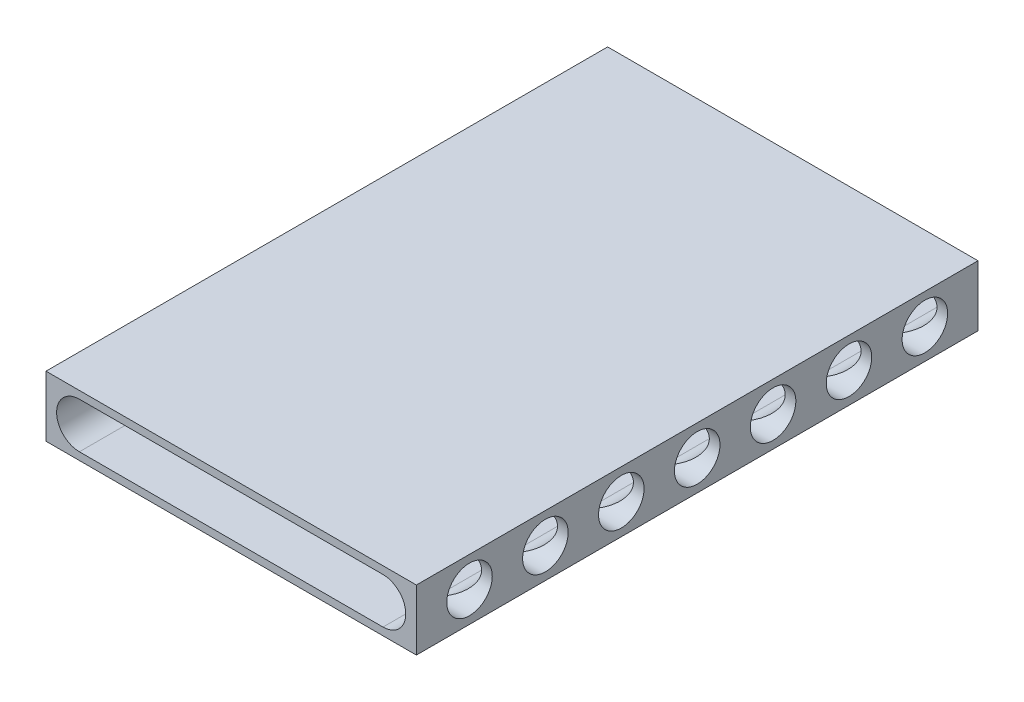
ISO-10303-21;
HEADER;
FILE_DESCRIPTION(('STEP AP214'),'2;1');
FILE_NAME('part.step','',(''),(''),'','','');
FILE_SCHEMA(('AUTOMOTIVE_DESIGN { 1 0 10303 214 1 1 1 1 }'));
ENDSEC;
DATA;
#1=APPLICATION_CONTEXT('core data for automotive mechanical design processes');
#2=APPLICATION_PROTOCOL_DEFINITION('international standard','automotive_design',2000,#1);
#3=PRODUCT_CONTEXT('',#1,'mechanical');
#4=PRODUCT('Part','Part','',(#3));
#5=PRODUCT_RELATED_PRODUCT_CATEGORY('part','',(#4));
#6=PRODUCT_DEFINITION_FORMATION('','',#4);
#7=PRODUCT_DEFINITION_CONTEXT('part definition',#1,'design');
#8=PRODUCT_DEFINITION('design','',#6,#7);
#9=PRODUCT_DEFINITION_SHAPE('','',#8);
#10=(LENGTH_UNIT() NAMED_UNIT(*) SI_UNIT(.MILLI.,.METRE.));
#11=(NAMED_UNIT(*) PLANE_ANGLE_UNIT() SI_UNIT($,.RADIAN.));
#12=(NAMED_UNIT(*) SI_UNIT($,.STERADIAN.) SOLID_ANGLE_UNIT());
#13=UNCERTAINTY_MEASURE_WITH_UNIT(LENGTH_MEASURE(1.E-05),#10,'distance_accuracy_value','');
#14=(GEOMETRIC_REPRESENTATION_CONTEXT(3) GLOBAL_UNCERTAINTY_ASSIGNED_CONTEXT((#13)) GLOBAL_UNIT_ASSIGNED_CONTEXT((#10,
#11,#12)) REPRESENTATION_CONTEXT('',''));
#15=CARTESIAN_POINT('',(0.,0.,0.));
#16=DIRECTION('',(0.,0.,1.));
#17=DIRECTION('',(1.,0.,0.));
#18=AXIS2_PLACEMENT_3D('',#15,#16,#17);
#19=CARTESIAN_POINT('',(50.,10.,-92.5));
#20=DIRECTION('',(0.,0.,1.));
#21=DIRECTION('',(1.,0.,0.));
#22=AXIS2_PLACEMENT_3D('',#19,#20,#21);
#23=CYLINDRICAL_SURFACE('',#22,7.5);
#24=DIRECTION('',(0.,0.,1.));
#25=VECTOR('',#24,1.);
#26=CARTESIAN_POINT('',(50.,2.50000000000003,-92.5));
#27=LINE('',#26,#25);
#28=CARTESIAN_POINT('',(50.,2.50000000000003,50.));
#29=VERTEX_POINT('',#28);
#30=CARTESIAN_POINT('',(50.,2.50000000000003,75.));
#31=VERTEX_POINT('',#30);
#32=EDGE_CURVE('E163',#29,#31,#27,.T.);
#33=ORIENTED_EDGE('',*,*,#32,.T.);
#34=CARTESIAN_POINT('',(50.,10.,75.));
#35=DIRECTION('',(0.707106781186547,0.,0.707106781186547));
#36=DIRECTION('',(0.707106781186547,0.,-0.707106781186547));
#37=AXIS2_PLACEMENT_3D('',#34,#35,#36);
#38=ELLIPSE('',#37,10.6066017177982,7.50000000000001);
#39=CARTESIAN_POINT('',(50.,17.5,75.));
#40=VERTEX_POINT('',#39);
#41=EDGE_CURVE('E58',#40,#31,#38,.F.);
#42=ORIENTED_EDGE('',*,*,#41,.F.);
#43=DIRECTION('',(0.,0.,1.));
#44=VECTOR('',#43,1.);
#45=CARTESIAN_POINT('',(50.,17.5,-92.5));
#46=LINE('',#45,#44);
#47=CARTESIAN_POINT('',(50.,17.5,50.));
#48=VERTEX_POINT('',#47);
#49=EDGE_CURVE('E160',#48,#40,#46,.T.);
#50=ORIENTED_EDGE('',*,*,#49,.F.);
#51=CARTESIAN_POINT('',(50.,10.,50.));
#52=DIRECTION('',(0.707106781186547,0.,-0.707106781186547));
#53=DIRECTION('',(0.707106781186547,0.,0.707106781186547));
#54=AXIS2_PLACEMENT_3D('',#51,#52,#53);
#55=ELLIPSE('',#54,10.6066017177982,7.50000000000001);
#56=EDGE_CURVE('E154',#29,#48,#55,.F.);
#57=ORIENTED_EDGE('',*,*,#56,.F.);
#58=EDGE_LOOP('',(#33,#42,#50,#57));
#59=FACE_BOUND('',#58,.T.);
#60=ADVANCED_FACE('F43',(#59),#23,.F.);
#61=CARTESIAN_POINT('',(50.,2.50000000000003,25.));
#62=VERTEX_POINT('',#61);
#63=EDGE_CURVE('E340',#62,#29,#27,.T.);
#64=ORIENTED_EDGE('',*,*,#63,.T.);
#65=CARTESIAN_POINT('',(50.,10.,50.));
#66=DIRECTION('',(0.707106781186547,0.,0.707106781186547));
#67=DIRECTION('',(0.707106781186547,0.,-0.707106781186547));
#68=AXIS2_PLACEMENT_3D('',#65,#66,#67);
#69=ELLIPSE('',#68,10.6066017177982,7.50000000000001);
#70=EDGE_CURVE('E65',#48,#29,#69,.F.);
#71=ORIENTED_EDGE('',*,*,#70,.F.);
#72=CARTESIAN_POINT('',(50.,17.5,25.));
#73=VERTEX_POINT('',#72);
#74=EDGE_CURVE('E182',#73,#48,#46,.T.);
#75=ORIENTED_EDGE('',*,*,#74,.F.);
#76=CARTESIAN_POINT('',(50.,10.,25.));
#77=DIRECTION('',(0.707106781186547,0.,-0.707106781186547));
#78=DIRECTION('',(0.707106781186547,0.,0.707106781186547));
#79=AXIS2_PLACEMENT_3D('',#76,#77,#78);
#80=ELLIPSE('',#79,10.6066017177982,7.50000000000001);
#81=EDGE_CURVE('E412',#62,#73,#80,.F.);
#82=ORIENTED_EDGE('',*,*,#81,.F.);
#83=EDGE_LOOP('',(#64,#71,#75,#82));
#84=FACE_BOUND('',#83,.T.);
#85=ADVANCED_FACE('F270',(#84),#23,.F.);
#86=CARTESIAN_POINT('',(50.,2.50000000000003,0.));
#87=VERTEX_POINT('',#86);
#88=EDGE_CURVE('E342',#87,#62,#27,.T.);
#89=ORIENTED_EDGE('',*,*,#88,.T.);
#90=CARTESIAN_POINT('',(50.,10.,25.));
#91=DIRECTION('',(0.707106781186547,0.,0.707106781186547));
#92=DIRECTION('',(0.707106781186547,0.,-0.707106781186547));
#93=AXIS2_PLACEMENT_3D('',#90,#91,#92);
#94=ELLIPSE('',#93,10.6066017177982,7.50000000000001);
#95=EDGE_CURVE('E409',#73,#62,#94,.F.);
#96=ORIENTED_EDGE('',*,*,#95,.F.);
#97=CARTESIAN_POINT('',(50.,17.5,0.));
#98=VERTEX_POINT('',#97);
#99=EDGE_CURVE('E185',#98,#73,#46,.T.);
#100=ORIENTED_EDGE('',*,*,#99,.F.);
#101=CARTESIAN_POINT('',(50.,10.,0.));
#102=DIRECTION('',(0.707106781186547,0.,-0.707106781186547));
#103=DIRECTION('',(0.707106781186547,0.,0.707106781186547));
#104=AXIS2_PLACEMENT_3D('',#101,#102,#103);
#105=ELLIPSE('',#104,10.6066017177982,7.50000000000001);
#106=EDGE_CURVE('E402',#87,#98,#105,.F.);
#107=ORIENTED_EDGE('',*,*,#106,.F.);
#108=EDGE_LOOP('',(#89,#96,#100,#107));
#109=FACE_BOUND('',#108,.T.);
#110=ADVANCED_FACE('F275',(#109),#23,.F.);
#111=CARTESIAN_POINT('',(50.,2.50000000000003,-25.));
#112=VERTEX_POINT('',#111);
#113=EDGE_CURVE('E346',#112,#87,#27,.T.);
#114=ORIENTED_EDGE('',*,*,#113,.T.);
#115=CARTESIAN_POINT('',(50.,10.,0.));
#116=DIRECTION('',(0.707106781186547,0.,0.707106781186547));
#117=DIRECTION('',(0.707106781186547,0.,-0.707106781186547));
#118=AXIS2_PLACEMENT_3D('',#115,#116,#117);
#119=ELLIPSE('',#118,10.6066017177982,7.50000000000001);
#120=EDGE_CURVE('E399',#98,#87,#119,.F.);
#121=ORIENTED_EDGE('',*,*,#120,.F.);
#122=CARTESIAN_POINT('',(50.,17.5,-25.));
#123=VERTEX_POINT('',#122);
#124=EDGE_CURVE('E668',#123,#98,#46,.T.);
#125=ORIENTED_EDGE('',*,*,#124,.F.);
#126=CARTESIAN_POINT('',(50.,10.,-25.));
#127=DIRECTION('',(0.707106781186547,0.,-0.707106781186547));
#128=DIRECTION('',(0.707106781186547,0.,0.707106781186547));
#129=AXIS2_PLACEMENT_3D('',#126,#127,#128);
#130=ELLIPSE('',#129,10.6066017177982,7.50000000000001);
#131=EDGE_CURVE('E392',#112,#123,#130,.F.);
#132=ORIENTED_EDGE('',*,*,#131,.F.);
#133=EDGE_LOOP('',(#114,#121,#125,#132));
#134=FACE_BOUND('',#133,.T.);
#135=ADVANCED_FACE('F546',(#134),#23,.F.);
#136=CARTESIAN_POINT('',(50.,2.50000000000003,-50.));
#137=VERTEX_POINT('',#136);
#138=EDGE_CURVE('E353',#137,#112,#27,.T.);
#139=ORIENTED_EDGE('',*,*,#138,.T.);
#140=CARTESIAN_POINT('',(50.,10.,-25.));
#141=DIRECTION('',(0.707106781186547,0.,0.707106781186547));
#142=DIRECTION('',(0.707106781186547,0.,-0.707106781186547));
#143=AXIS2_PLACEMENT_3D('',#140,#141,#142);
#144=ELLIPSE('',#143,10.6066017177982,7.50000000000001);
#145=EDGE_CURVE('E389',#123,#112,#144,.F.);
#146=ORIENTED_EDGE('',*,*,#145,.F.);
#147=CARTESIAN_POINT('',(50.,17.5,-50.));
#148=VERTEX_POINT('',#147);
#149=EDGE_CURVE('E671',#148,#123,#46,.T.);
#150=ORIENTED_EDGE('',*,*,#149,.F.);
#151=CARTESIAN_POINT('',(50.,10.,-50.));
#152=DIRECTION('',(0.707106781186547,0.,-0.707106781186547));
#153=DIRECTION('',(0.707106781186547,0.,0.707106781186547));
#154=AXIS2_PLACEMENT_3D('',#151,#152,#153);
#155=ELLIPSE('',#154,10.6066017177982,7.50000000000001);
#156=EDGE_CURVE('E385',#137,#148,#155,.F.);
#157=ORIENTED_EDGE('',*,*,#156,.F.);
#158=EDGE_LOOP('',(#139,#146,#150,#157));
#159=FACE_BOUND('',#158,.T.);
#160=ADVANCED_FACE('F294',(#159),#23,.F.);
#161=CARTESIAN_POINT('',(50.,2.50000000000003,-75.));
#162=VERTEX_POINT('',#161);
#163=EDGE_CURVE('E196',#162,#137,#27,.T.);
#164=ORIENTED_EDGE('',*,*,#163,.T.);
#165=CARTESIAN_POINT('',(50.,10.,-50.));
#166=DIRECTION('',(0.707106781186547,0.,0.707106781186547));
#167=DIRECTION('',(0.707106781186547,0.,-0.707106781186547));
#168=AXIS2_PLACEMENT_3D('',#165,#166,#167);
#169=ELLIPSE('',#168,10.6066017177982,7.50000000000001);
#170=EDGE_CURVE('E366',#148,#137,#169,.F.);
#171=ORIENTED_EDGE('',*,*,#170,.F.);
#172=CARTESIAN_POINT('',(50.,17.5,-75.));
#173=VERTEX_POINT('',#172);
#174=EDGE_CURVE('E191',#173,#148,#46,.T.);
#175=ORIENTED_EDGE('',*,*,#174,.F.);
#176=CARTESIAN_POINT('',(50.,10.,-75.));
#177=DIRECTION('',(0.707106781186547,0.,-0.707106781186547));
#178=DIRECTION('',(0.707106781186547,0.,0.707106781186547));
#179=AXIS2_PLACEMENT_3D('',#176,#177,#178);
#180=ELLIPSE('',#179,10.6066017177982,7.50000000000001);
#181=EDGE_CURVE('E368',#162,#173,#180,.F.);
#182=ORIENTED_EDGE('',*,*,#181,.F.);
#183=EDGE_LOOP('',(#164,#171,#175,#182));
#184=FACE_BOUND('',#183,.T.);
#185=ADVANCED_FACE('F289',(#184),#23,.F.);
#186=CARTESIAN_POINT('',(50.,2.50000000000001,-92.5));
#187=VERTEX_POINT('',#186);
#188=EDGE_CURVE('E176',#187,#162,#27,.T.);
#189=ORIENTED_EDGE('',*,*,#188,.T.);
#190=CARTESIAN_POINT('',(50.,10.,-75.));
#191=DIRECTION('',(0.707106781186547,0.,0.707106781186547));
#192=DIRECTION('',(0.707106781186547,0.,-0.707106781186547));
#193=AXIS2_PLACEMENT_3D('',#190,#191,#192);
#194=ELLIPSE('',#193,10.6066017177982,7.50000000000001);
#195=EDGE_CURVE('E298',#173,#162,#194,.F.);
#196=ORIENTED_EDGE('',*,*,#195,.F.);
#197=CARTESIAN_POINT('',(50.,17.5,-92.5));
#198=VERTEX_POINT('',#197);
#199=EDGE_CURVE('E178',#198,#173,#46,.T.);
#200=ORIENTED_EDGE('',*,*,#199,.F.);
#201=CARTESIAN_POINT('',(50.,10.,-92.5));
#202=DIRECTION('',(0.,0.,1.));
#203=DIRECTION('',(1.,0.,0.));
#204=AXIS2_PLACEMENT_3D('',#201,#202,#203);
#205=CIRCLE('',#204,7.5);
#206=EDGE_CURVE('E301',#187,#198,#205,.T.);
#207=ORIENTED_EDGE('',*,*,#206,.F.);
#208=EDGE_LOOP('',(#189,#196,#200,#207));
#209=FACE_BOUND('',#208,.T.);
#210=ADVANCED_FACE('F266',(#209),#23,.F.);
#211=CARTESIAN_POINT('',(61.,20.,92.5));
#212=DIRECTION('',(-1.,0.,0.));
#213=DIRECTION('',(0.,0.,1.));
#214=AXIS2_PLACEMENT_3D('',#211,#212,#213);
#215=PLANE('',#214);
#216=CARTESIAN_POINT('',(61.,10.,75.));
#217=DIRECTION('',(1.,0.,0.));
#218=DIRECTION('',(0.,0.,-1.));
#219=AXIS2_PLACEMENT_3D('',#216,#217,#218);
#220=CIRCLE('',#219,7.50000000000001);
#221=CARTESIAN_POINT('',(61.,10.,67.5));
#222=VERTEX_POINT('',#221);
#223=EDGE_CURVE('E165',#222,#222,#220,.T.);
#224=ORIENTED_EDGE('',*,*,#223,.F.);
#225=EDGE_LOOP('',(#224));
#226=FACE_BOUND('',#225,.T.);
#227=CARTESIAN_POINT('',(61.,10.,50.));
#228=DIRECTION('',(1.,0.,0.));
#229=DIRECTION('',(0.,0.,-1.));
#230=AXIS2_PLACEMENT_3D('',#227,#228,#229);
#231=CIRCLE('',#230,7.50000000000001);
#232=CARTESIAN_POINT('',(61.,10.,42.5));
#233=VERTEX_POINT('',#232);
#234=EDGE_CURVE('E415',#233,#233,#231,.T.);
#235=ORIENTED_EDGE('',*,*,#234,.F.);
#236=EDGE_LOOP('',(#235));
#237=FACE_BOUND('',#236,.T.);
#238=CARTESIAN_POINT('',(61.,10.,25.));
#239=DIRECTION('',(1.,0.,0.));
#240=DIRECTION('',(0.,0.,-1.));
#241=AXIS2_PLACEMENT_3D('',#238,#239,#240);
#242=CIRCLE('',#241,7.50000000000001);
#243=CARTESIAN_POINT('',(61.,10.,17.5));
#244=VERTEX_POINT('',#243);
#245=EDGE_CURVE('E405',#244,#244,#242,.T.);
#246=ORIENTED_EDGE('',*,*,#245,.F.);
#247=EDGE_LOOP('',(#246));
#248=FACE_BOUND('',#247,.T.);
#249=CARTESIAN_POINT('',(61.,10.,0.));
#250=DIRECTION('',(1.,0.,0.));
#251=DIRECTION('',(0.,0.,-1.));
#252=AXIS2_PLACEMENT_3D('',#249,#250,#251);
#253=CIRCLE('',#252,7.50000000000001);
#254=CARTESIAN_POINT('',(61.,10.,-7.50000000000003));
#255=VERTEX_POINT('',#254);
#256=EDGE_CURVE('E395',#255,#255,#253,.T.);
#257=ORIENTED_EDGE('',*,*,#256,.F.);
#258=EDGE_LOOP('',(#257));
#259=FACE_BOUND('',#258,.T.);
#260=CARTESIAN_POINT('',(61.,10.,-25.));
#261=DIRECTION('',(1.,0.,0.));
#262=DIRECTION('',(0.,0.,-1.));
#263=AXIS2_PLACEMENT_3D('',#260,#261,#262);
#264=CIRCLE('',#263,7.50000000000001);
#265=CARTESIAN_POINT('',(61.,10.,-32.5));
#266=VERTEX_POINT('',#265);
#267=EDGE_CURVE('E387',#266,#266,#264,.T.);
#268=ORIENTED_EDGE('',*,*,#267,.F.);
#269=EDGE_LOOP('',(#268));
#270=FACE_BOUND('',#269,.T.);
#271=CARTESIAN_POINT('',(61.,10.,-50.));
#272=DIRECTION('',(1.,0.,0.));
#273=DIRECTION('',(0.,0.,-1.));
#274=AXIS2_PLACEMENT_3D('',#271,#272,#273);
#275=CIRCLE('',#274,7.50000000000001);
#276=CARTESIAN_POINT('',(61.,10.,-57.5));
#277=VERTEX_POINT('',#276);
#278=EDGE_CURVE('E372',#277,#277,#275,.T.);
#279=ORIENTED_EDGE('',*,*,#278,.F.);
#280=EDGE_LOOP('',(#279));
#281=FACE_BOUND('',#280,.T.);
#282=CARTESIAN_POINT('',(61.,10.,-75.));
#283=DIRECTION('',(1.,0.,0.));
#284=DIRECTION('',(0.,0.,-1.));
#285=AXIS2_PLACEMENT_3D('',#282,#283,#284);
#286=CIRCLE('',#285,7.50000000000001);
#287=CARTESIAN_POINT('',(61.,10.,-82.5));
#288=VERTEX_POINT('',#287);
#289=EDGE_CURVE('E378',#288,#288,#286,.T.);
#290=ORIENTED_EDGE('',*,*,#289,.F.);
#291=EDGE_LOOP('',(#290));
#292=FACE_BOUND('',#291,.T.);
#293=DIRECTION('',(0.,0.,-1.));
#294=VECTOR('',#293,1.);
#295=CARTESIAN_POINT('',(61.,0.,92.5));
#296=LINE('',#295,#294);
#297=CARTESIAN_POINT('',(61.,0.,92.5));
#298=VERTEX_POINT('',#297);
#299=CARTESIAN_POINT('',(61.,0.,-92.5));
#300=VERTEX_POINT('',#299);
#301=EDGE_CURVE('E218',#298,#300,#296,.T.);
#302=ORIENTED_EDGE('',*,*,#301,.T.);
#303=DIRECTION('',(0.,-1.,0.));
#304=VECTOR('',#303,1.);
#305=CARTESIAN_POINT('',(61.,20.,-92.5));
#306=LINE('',#305,#304);
#307=CARTESIAN_POINT('',(61.,20.,-92.5));
#308=VERTEX_POINT('',#307);
#309=EDGE_CURVE('E11',#308,#300,#306,.T.);
#310=ORIENTED_EDGE('',*,*,#309,.F.);
#311=DIRECTION('',(0.,0.,-1.));
#312=VECTOR('',#311,1.);
#313=CARTESIAN_POINT('',(61.,20.,92.5));
#314=LINE('',#313,#312);
#315=CARTESIAN_POINT('',(61.,20.,92.5));
#316=VERTEX_POINT('',#315);
#317=EDGE_CURVE('E203',#316,#308,#314,.T.);
#318=ORIENTED_EDGE('',*,*,#317,.F.);
#319=DIRECTION('',(0.,-1.,0.));
#320=VECTOR('',#319,1.);
#321=CARTESIAN_POINT('',(61.,20.,92.5));
#322=LINE('',#321,#320);
#323=EDGE_CURVE('E217',#316,#298,#322,.T.);
#324=ORIENTED_EDGE('',*,*,#323,.T.);
#325=EDGE_LOOP('',(#302,#310,#318,#324));
#326=FACE_BOUND('',#325,.T.);
#327=ADVANCED_FACE('F45',(#226,#237,#248,#259,#270,#281,#292,#326),#215,.F.);
#328=CARTESIAN_POINT('',(-61.,20.,-92.5));
#329=DIRECTION('',(0.,0.,1.));
#330=DIRECTION('',(1.,0.,0.));
#331=AXIS2_PLACEMENT_3D('',#328,#329,#330);
#332=PLANE('',#331);
#333=DIRECTION('',(-1.,0.,0.));
#334=VECTOR('',#333,1.);
#335=CARTESIAN_POINT('',(-50.,17.5,-92.5));
#336=LINE('',#335,#334);
#337=CARTESIAN_POINT('',(-50.,17.5,-92.5));
#338=VERTEX_POINT('',#337);
#339=EDGE_CURVE('E202',#198,#338,#336,.T.);
#340=ORIENTED_EDGE('',*,*,#339,.T.);
#341=CARTESIAN_POINT('',(-50.,10.,-92.5));
#342=DIRECTION('',(0.,0.,1.));
#343=DIRECTION('',(1.,0.,0.));
#344=AXIS2_PLACEMENT_3D('',#341,#342,#343);
#345=CIRCLE('',#344,7.5);
#346=CARTESIAN_POINT('',(-50.,2.5,-92.5));
#347=VERTEX_POINT('',#346);
#348=EDGE_CURVE('E311',#338,#347,#345,.T.);
#349=ORIENTED_EDGE('',*,*,#348,.T.);
#350=DIRECTION('',(1.,0.,0.));
#351=VECTOR('',#350,1.);
#352=CARTESIAN_POINT('',(-50.,2.5,-92.5));
#353=LINE('',#352,#351);
#354=EDGE_CURVE('E306',#347,#187,#353,.T.);
#355=ORIENTED_EDGE('',*,*,#354,.T.);
#356=ORIENTED_EDGE('',*,*,#206,.T.);
#357=EDGE_LOOP('',(#340,#349,#355,#356));
#358=FACE_BOUND('',#357,.T.);
#359=DIRECTION('',(-1.,0.,0.));
#360=VECTOR('',#359,1.);
#361=CARTESIAN_POINT('',(-61.,0.,-92.5));
#362=LINE('',#361,#360);
#363=CARTESIAN_POINT('',(-61.,0.,-92.5));
#364=VERTEX_POINT('',#363);
#365=EDGE_CURVE('E222',#300,#364,#362,.T.);
#366=ORIENTED_EDGE('',*,*,#365,.T.);
#367=DIRECTION('',(0.,-1.,0.));
#368=VECTOR('',#367,1.);
#369=CARTESIAN_POINT('',(-61.,20.,-92.5));
#370=LINE('',#369,#368);
#371=CARTESIAN_POINT('',(-61.,20.,-92.5));
#372=VERTEX_POINT('',#371);
#373=EDGE_CURVE('E52',#372,#364,#370,.T.);
#374=ORIENTED_EDGE('',*,*,#373,.F.);
#375=DIRECTION('',(-1.,0.,0.));
#376=VECTOR('',#375,1.);
#377=CARTESIAN_POINT('',(-61.,20.,-92.5));
#378=LINE('',#377,#376);
#379=EDGE_CURVE('E207',#308,#372,#378,.T.);
#380=ORIENTED_EDGE('',*,*,#379,.F.);
#381=ORIENTED_EDGE('',*,*,#309,.T.);
#382=EDGE_LOOP('',(#366,#374,#380,#381));
#383=FACE_BOUND('',#382,.T.);
#384=ADVANCED_FACE('F258',(#358,#383),#332,.F.);
#385=CARTESIAN_POINT('',(-61.,20.,92.5));
#386=DIRECTION('',(1.,0.,0.));
#387=DIRECTION('',(0.,0.,-1.));
#388=AXIS2_PLACEMENT_3D('',#385,#386,#387);
#389=PLANE('',#388);
#390=DIRECTION('',(0.,0.,1.));
#391=VECTOR('',#390,1.);
#392=CARTESIAN_POINT('',(-61.,0.,92.5));
#393=LINE('',#392,#391);
#394=CARTESIAN_POINT('',(-61.,0.,92.5));
#395=VERTEX_POINT('',#394);
#396=EDGE_CURVE('E225',#364,#395,#393,.T.);
#397=ORIENTED_EDGE('',*,*,#396,.T.);
#398=DIRECTION('',(0.,-1.,0.));
#399=VECTOR('',#398,1.);
#400=CARTESIAN_POINT('',(-61.,20.,92.5));
#401=LINE('',#400,#399);
#402=CARTESIAN_POINT('',(-61.,20.,92.5));
#403=VERTEX_POINT('',#402);
#404=EDGE_CURVE('E233',#403,#395,#401,.T.);
#405=ORIENTED_EDGE('',*,*,#404,.F.);
#406=DIRECTION('',(0.,0.,1.));
#407=VECTOR('',#406,1.);
#408=CARTESIAN_POINT('',(-61.,20.,92.5));
#409=LINE('',#408,#407);
#410=EDGE_CURVE('E211',#372,#403,#409,.T.);
#411=ORIENTED_EDGE('',*,*,#410,.F.);
#412=ORIENTED_EDGE('',*,*,#373,.T.);
#413=EDGE_LOOP('',(#397,#405,#411,#412));
#414=FACE_BOUND('',#413,.T.);
#415=ADVANCED_FACE('F242',(#414),#389,.F.);
#416=CARTESIAN_POINT('',(-61.,20.,92.5));
#417=DIRECTION('',(0.,0.,-1.));
#418=DIRECTION('',(-1.,0.,0.));
#419=AXIS2_PLACEMENT_3D('',#416,#417,#418);
#420=PLANE('',#419);
#421=DIRECTION('',(1.,0.,0.));
#422=VECTOR('',#421,1.);
#423=CARTESIAN_POINT('',(-50.,2.5,92.5));
#424=LINE('',#423,#422);
#425=CARTESIAN_POINT('',(-50.,2.5,92.5));
#426=VERTEX_POINT('',#425);
#427=CARTESIAN_POINT('',(50.,2.50000000000003,92.5));
#428=VERTEX_POINT('',#427);
#429=EDGE_CURVE('E326',#426,#428,#424,.T.);
#430=ORIENTED_EDGE('',*,*,#429,.F.);
#431=CARTESIAN_POINT('',(-50.,10.,92.5));
#432=DIRECTION('',(0.,0.,1.));
#433=DIRECTION('',(1.,0.,0.));
#434=AXIS2_PLACEMENT_3D('',#431,#432,#433);
#435=CIRCLE('',#434,7.5);
#436=CARTESIAN_POINT('',(-50.,17.5,92.5));
#437=VERTEX_POINT('',#436);
#438=EDGE_CURVE('E323',#437,#426,#435,.T.);
#439=ORIENTED_EDGE('',*,*,#438,.F.);
#440=DIRECTION('',(-1.,0.,0.));
#441=VECTOR('',#440,1.);
#442=CARTESIAN_POINT('',(-50.,17.5,92.5));
#443=LINE('',#442,#441);
#444=CARTESIAN_POINT('',(50.,17.5,92.5));
#445=VERTEX_POINT('',#444);
#446=EDGE_CURVE('E317',#445,#437,#443,.T.);
#447=ORIENTED_EDGE('',*,*,#446,.F.);
#448=CARTESIAN_POINT('',(50.,10.,92.5));
#449=DIRECTION('',(0.,0.,1.));
#450=DIRECTION('',(1.,0.,0.));
#451=AXIS2_PLACEMENT_3D('',#448,#449,#450);
#452=CIRCLE('',#451,7.5);
#453=EDGE_CURVE('E171',#428,#445,#452,.T.);
#454=ORIENTED_EDGE('',*,*,#453,.F.);
#455=EDGE_LOOP('',(#430,#439,#447,#454));
#456=FACE_BOUND('',#455,.T.);
#457=DIRECTION('',(1.,0.,0.));
#458=VECTOR('',#457,1.);
#459=CARTESIAN_POINT('',(-61.,0.,92.5));
#460=LINE('',#459,#458);
#461=EDGE_CURVE('E208',#395,#298,#460,.T.);
#462=ORIENTED_EDGE('',*,*,#461,.T.);
#463=ORIENTED_EDGE('',*,*,#323,.F.);
#464=DIRECTION('',(1.,0.,0.));
#465=VECTOR('',#464,1.);
#466=CARTESIAN_POINT('',(-61.,20.,92.5));
#467=LINE('',#466,#465);
#468=EDGE_CURVE('E214',#403,#316,#467,.T.);
#469=ORIENTED_EDGE('',*,*,#468,.F.);
#470=ORIENTED_EDGE('',*,*,#404,.T.);
#471=EDGE_LOOP('',(#462,#463,#469,#470));
#472=FACE_BOUND('',#471,.T.);
#473=ADVANCED_FACE('F251',(#456,#472),#420,.F.);
#474=CARTESIAN_POINT('',(0.,20.,0.));
#475=DIRECTION('',(0.,-1.,0.));
#476=DIRECTION('',(0.,0.,-1.));
#477=AXIS2_PLACEMENT_3D('',#474,#475,#476);
#478=PLANE('',#477);
#479=ORIENTED_EDGE('',*,*,#317,.T.);
#480=ORIENTED_EDGE('',*,*,#379,.T.);
#481=ORIENTED_EDGE('',*,*,#410,.T.);
#482=ORIENTED_EDGE('',*,*,#468,.T.);
#483=EDGE_LOOP('',(#479,#480,#481,#482));
#484=FACE_BOUND('',#483,.T.);
#485=ADVANCED_FACE('F257',(#484),#478,.F.);
#486=CARTESIAN_POINT('',(0.,0.,0.));
#487=DIRECTION('',(0.,-1.,0.));
#488=DIRECTION('',(0.,0.,-1.));
#489=AXIS2_PLACEMENT_3D('',#486,#487,#488);
#490=PLANE('',#489);
#491=ORIENTED_EDGE('',*,*,#301,.F.);
#492=ORIENTED_EDGE('',*,*,#461,.F.);
#493=ORIENTED_EDGE('',*,*,#396,.F.);
#494=ORIENTED_EDGE('',*,*,#365,.F.);
#495=EDGE_LOOP('',(#491,#492,#493,#494));
#496=FACE_BOUND('',#495,.T.);
#497=ADVANCED_FACE('F248',(#496),#490,.T.);
#498=CARTESIAN_POINT('',(-50.,10.,-92.5));
#499=DIRECTION('',(0.,0.,1.));
#500=DIRECTION('',(1.,0.,0.));
#501=AXIS2_PLACEMENT_3D('',#498,#499,#500);
#502=CYLINDRICAL_SURFACE('',#501,7.5);
#503=ORIENTED_EDGE('',*,*,#438,.T.);
#504=DIRECTION('',(0.,0.,1.));
#505=VECTOR('',#504,1.);
#506=CARTESIAN_POINT('',(-50.,2.5,-92.5));
#507=LINE('',#506,#505);
#508=EDGE_CURVE('E198',#347,#426,#507,.T.);
#509=ORIENTED_EDGE('',*,*,#508,.F.);
#510=ORIENTED_EDGE('',*,*,#348,.F.);
#511=DIRECTION('',(0.,0.,1.));
#512=VECTOR('',#511,1.);
#513=CARTESIAN_POINT('',(-50.,17.5,-92.5));
#514=LINE('',#513,#512);
#515=EDGE_CURVE('E190',#338,#437,#514,.T.);
#516=ORIENTED_EDGE('',*,*,#515,.T.);
#517=EDGE_LOOP('',(#503,#509,#510,#516));
#518=FACE_BOUND('',#517,.T.);
#519=ADVANCED_FACE('F287',(#518),#502,.F.);
#520=CARTESIAN_POINT('',(-50.,17.5,-92.5));
#521=DIRECTION('',(0.,1.,0.));
#522=DIRECTION('',(-1.,0.,0.));
#523=AXIS2_PLACEMENT_3D('',#520,#521,#522);
#524=PLANE('',#523);
#525=ORIENTED_EDGE('',*,*,#446,.T.);
#526=ORIENTED_EDGE('',*,*,#515,.F.);
#527=ORIENTED_EDGE('',*,*,#339,.F.);
#528=ORIENTED_EDGE('',*,*,#199,.T.);
#529=ORIENTED_EDGE('',*,*,#174,.T.);
#530=ORIENTED_EDGE('',*,*,#149,.T.);
#531=ORIENTED_EDGE('',*,*,#124,.T.);
#532=ORIENTED_EDGE('',*,*,#99,.T.);
#533=ORIENTED_EDGE('',*,*,#74,.T.);
#534=ORIENTED_EDGE('',*,*,#49,.T.);
#535=EDGE_CURVE('E168',#40,#445,#46,.T.);
#536=ORIENTED_EDGE('',*,*,#535,.T.);
#537=EDGE_LOOP('',(#525,#526,#527,#528,#529,#530,#531,#532,#533,#534,#536));
#538=FACE_BOUND('',#537,.T.);
#539=ADVANCED_FACE('F179',(#538),#524,.F.);
#540=ORIENTED_EDGE('',*,*,#535,.F.);
#541=CARTESIAN_POINT('',(50.,10.,75.));
#542=DIRECTION('',(0.707106781186547,0.,-0.707106781186547));
#543=DIRECTION('',(0.707106781186547,0.,0.707106781186547));
#544=AXIS2_PLACEMENT_3D('',#541,#542,#543);
#545=ELLIPSE('',#544,10.6066017177982,7.50000000000001);
#546=EDGE_CURVE('E148',#31,#40,#545,.F.);
#547=ORIENTED_EDGE('',*,*,#546,.F.);
#548=EDGE_CURVE('E197',#31,#428,#27,.T.);
#549=ORIENTED_EDGE('',*,*,#548,.T.);
#550=ORIENTED_EDGE('',*,*,#453,.T.);
#551=EDGE_LOOP('',(#540,#547,#549,#550));
#552=FACE_BOUND('',#551,.T.);
#553=ADVANCED_FACE('F169',(#552),#23,.F.);
#554=CARTESIAN_POINT('',(-50.,2.5,-92.5));
#555=DIRECTION('',(0.,-1.,0.));
#556=DIRECTION('',(1.,0.,0.));
#557=AXIS2_PLACEMENT_3D('',#554,#555,#556);
#558=PLANE('',#557);
#559=ORIENTED_EDGE('',*,*,#429,.T.);
#560=ORIENTED_EDGE('',*,*,#548,.F.);
#561=ORIENTED_EDGE('',*,*,#32,.F.);
#562=ORIENTED_EDGE('',*,*,#63,.F.);
#563=ORIENTED_EDGE('',*,*,#88,.F.);
#564=ORIENTED_EDGE('',*,*,#113,.F.);
#565=ORIENTED_EDGE('',*,*,#138,.F.);
#566=ORIENTED_EDGE('',*,*,#163,.F.);
#567=ORIENTED_EDGE('',*,*,#188,.F.);
#568=ORIENTED_EDGE('',*,*,#354,.F.);
#569=ORIENTED_EDGE('',*,*,#508,.T.);
#570=EDGE_LOOP('',(#559,#560,#561,#562,#563,#564,#565,#566,#567,#568,#569));
#571=FACE_BOUND('',#570,.T.);
#572=ADVANCED_FACE('F280',(#571),#558,.F.);
#573=CARTESIAN_POINT('',(-61.001,10.,-75.));
#574=DIRECTION('',(1.,0.,0.));
#575=DIRECTION('',(0.,0.,-1.));
#576=AXIS2_PLACEMENT_3D('',#573,#574,#575);
#577=CYLINDRICAL_SURFACE('',#576,7.50000000000001);
#578=ORIENTED_EDGE('',*,*,#289,.T.);
#579=EDGE_LOOP('',(#578));
#580=FACE_BOUND('',#579,.T.);
#581=ORIENTED_EDGE('',*,*,#195,.T.);
#582=ORIENTED_EDGE('',*,*,#181,.T.);
#583=EDGE_LOOP('',(#581,#582));
#584=FACE_BOUND('',#583,.T.);
#585=ADVANCED_FACE('F285',(#580,#584),#577,.F.);
#586=CARTESIAN_POINT('',(-61.001,10.,-50.));
#587=DIRECTION('',(1.,0.,0.));
#588=DIRECTION('',(0.,0.,-1.));
#589=AXIS2_PLACEMENT_3D('',#586,#587,#588);
#590=CYLINDRICAL_SURFACE('',#589,7.50000000000001);
#591=ORIENTED_EDGE('',*,*,#278,.T.);
#592=EDGE_LOOP('',(#591));
#593=FACE_BOUND('',#592,.T.);
#594=ORIENTED_EDGE('',*,*,#170,.T.);
#595=ORIENTED_EDGE('',*,*,#156,.T.);
#596=EDGE_LOOP('',(#594,#595));
#597=FACE_BOUND('',#596,.T.);
#598=ADVANCED_FACE('F444',(#593,#597),#590,.F.);
#599=CARTESIAN_POINT('',(-61.001,10.,-25.));
#600=DIRECTION('',(1.,0.,0.));
#601=DIRECTION('',(0.,0.,-1.));
#602=AXIS2_PLACEMENT_3D('',#599,#600,#601);
#603=CYLINDRICAL_SURFACE('',#602,7.50000000000001);
#604=ORIENTED_EDGE('',*,*,#267,.T.);
#605=EDGE_LOOP('',(#604));
#606=FACE_BOUND('',#605,.T.);
#607=ORIENTED_EDGE('',*,*,#145,.T.);
#608=ORIENTED_EDGE('',*,*,#131,.T.);
#609=EDGE_LOOP('',(#607,#608));
#610=FACE_BOUND('',#609,.T.);
#611=ADVANCED_FACE('F449',(#606,#610),#603,.F.);
#612=CARTESIAN_POINT('',(-61.001,10.,0.));
#613=DIRECTION('',(1.,0.,0.));
#614=DIRECTION('',(0.,0.,-1.));
#615=AXIS2_PLACEMENT_3D('',#612,#613,#614);
#616=CYLINDRICAL_SURFACE('',#615,7.50000000000001);
#617=ORIENTED_EDGE('',*,*,#256,.T.);
#618=EDGE_LOOP('',(#617));
#619=FACE_BOUND('',#618,.T.);
#620=ORIENTED_EDGE('',*,*,#120,.T.);
#621=ORIENTED_EDGE('',*,*,#106,.T.);
#622=EDGE_LOOP('',(#620,#621));
#623=FACE_BOUND('',#622,.T.);
#624=ADVANCED_FACE('F455',(#619,#623),#616,.F.);
#625=CARTESIAN_POINT('',(-61.001,10.,25.));
#626=DIRECTION('',(1.,0.,0.));
#627=DIRECTION('',(0.,0.,-1.));
#628=AXIS2_PLACEMENT_3D('',#625,#626,#627);
#629=CYLINDRICAL_SURFACE('',#628,7.50000000000001);
#630=ORIENTED_EDGE('',*,*,#245,.T.);
#631=EDGE_LOOP('',(#630));
#632=FACE_BOUND('',#631,.T.);
#633=ORIENTED_EDGE('',*,*,#95,.T.);
#634=ORIENTED_EDGE('',*,*,#81,.T.);
#635=EDGE_LOOP('',(#633,#634));
#636=FACE_BOUND('',#635,.T.);
#637=ADVANCED_FACE('F459',(#632,#636),#629,.F.);
#638=CARTESIAN_POINT('',(-61.001,10.,50.));
#639=DIRECTION('',(1.,0.,0.));
#640=DIRECTION('',(0.,0.,-1.));
#641=AXIS2_PLACEMENT_3D('',#638,#639,#640);
#642=CYLINDRICAL_SURFACE('',#641,7.50000000000001);
#643=ORIENTED_EDGE('',*,*,#234,.T.);
#644=EDGE_LOOP('',(#643));
#645=FACE_BOUND('',#644,.T.);
#646=ORIENTED_EDGE('',*,*,#70,.T.);
#647=ORIENTED_EDGE('',*,*,#56,.T.);
#648=EDGE_LOOP('',(#646,#647));
#649=FACE_BOUND('',#648,.T.);
#650=ADVANCED_FACE('F463',(#645,#649),#642,.F.);
#651=CARTESIAN_POINT('',(-61.001,10.,75.));
#652=DIRECTION('',(1.,0.,0.));
#653=DIRECTION('',(0.,0.,-1.));
#654=AXIS2_PLACEMENT_3D('',#651,#652,#653);
#655=CYLINDRICAL_SURFACE('',#654,7.50000000000001);
#656=ORIENTED_EDGE('',*,*,#223,.T.);
#657=EDGE_LOOP('',(#656));
#658=FACE_BOUND('',#657,.T.);
#659=ORIENTED_EDGE('',*,*,#41,.T.);
#660=ORIENTED_EDGE('',*,*,#546,.T.);
#661=EDGE_LOOP('',(#659,#660));
#662=FACE_BOUND('',#661,.T.);
#663=ADVANCED_FACE('F149',(#658,#662),#655,.F.);
#664=CLOSED_SHELL('',(#60,#85,#110,#135,#160,#185,#210,#327,#384,#415,#473,#485,#497,#519,#539,
#553,#572,#585,#598,#611,#624,#637,#650,#663));
#665=MANIFOLD_SOLID_BREP('B2',#664);
#666=ADVANCED_BREP_SHAPE_REPRESENTATION('',(#18,#665),#14);
#667=SHAPE_DEFINITION_REPRESENTATION(#9,#666);
ENDSEC;
END-ISO-10303-21;
